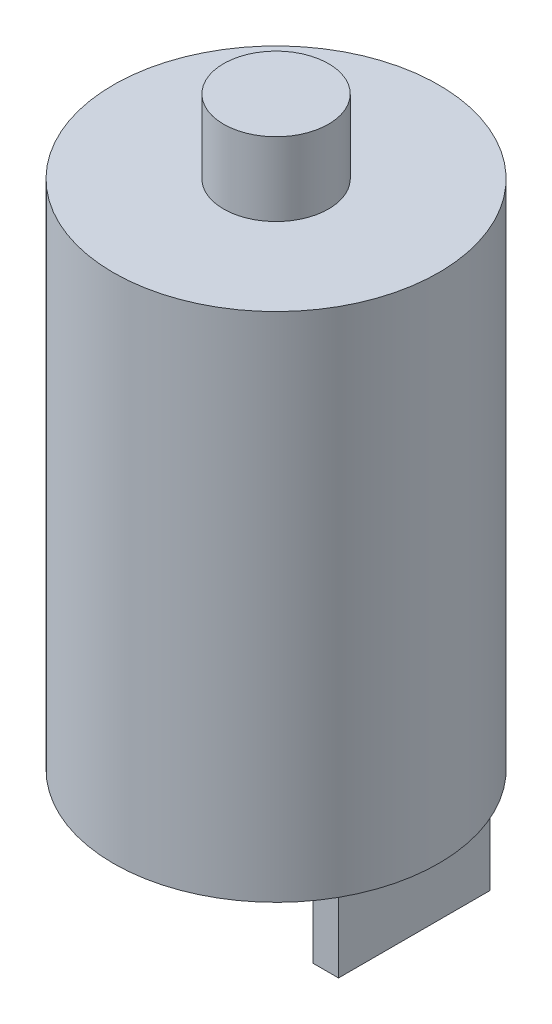
ISO-10303-21;
HEADER;
FILE_DESCRIPTION(('STEP AP214'),'2;1');
FILE_NAME('part.step','',(''),(''),'','','');
FILE_SCHEMA(('AUTOMOTIVE_DESIGN { 1 0 10303 214 1 1 1 1 }'));
ENDSEC;
DATA;
#1=APPLICATION_CONTEXT('core data for automotive mechanical design processes');
#2=APPLICATION_PROTOCOL_DEFINITION('international standard','automotive_design',2000,#1);
#3=PRODUCT_CONTEXT('',#1,'mechanical');
#4=PRODUCT('Part','Part','',(#3));
#5=PRODUCT_RELATED_PRODUCT_CATEGORY('part','',(#4));
#6=PRODUCT_DEFINITION_FORMATION('','',#4);
#7=PRODUCT_DEFINITION_CONTEXT('part definition',#1,'design');
#8=PRODUCT_DEFINITION('design','',#6,#7);
#9=PRODUCT_DEFINITION_SHAPE('','',#8);
#10=(LENGTH_UNIT() NAMED_UNIT(*) SI_UNIT(.MILLI.,.METRE.));
#11=(NAMED_UNIT(*) PLANE_ANGLE_UNIT() SI_UNIT($,.RADIAN.));
#12=(NAMED_UNIT(*) SI_UNIT($,.STERADIAN.) SOLID_ANGLE_UNIT());
#13=UNCERTAINTY_MEASURE_WITH_UNIT(LENGTH_MEASURE(1.E-05),#10,'distance_accuracy_value','');
#14=(GEOMETRIC_REPRESENTATION_CONTEXT(3) GLOBAL_UNCERTAINTY_ASSIGNED_CONTEXT((#13)) GLOBAL_UNIT_ASSIGNED_CONTEXT((#10,
#11,#12)) REPRESENTATION_CONTEXT('',''));
#15=CARTESIAN_POINT('',(0.,0.,0.));
#16=DIRECTION('',(0.,0.,1.));
#17=DIRECTION('',(1.,0.,0.));
#18=AXIS2_PLACEMENT_3D('',#15,#16,#17);
#19=CARTESIAN_POINT('',(0.,0.,0.));
#20=DIRECTION('',(0.,1.,0.));
#21=DIRECTION('',(0.,0.,1.));
#22=AXIS2_PLACEMENT_3D('',#19,#20,#21);
#23=PLANE('',#22);
#24=DIRECTION('',(0.,0.,-1.));
#25=VECTOR('',#24,1.);
#26=CARTESIAN_POINT('',(4.3072,0.,2.8899));
#27=LINE('',#26,#25);
#28=CARTESIAN_POINT('',(4.3072,0.,2.8899));
#29=VERTEX_POINT('',#28);
#30=CARTESIAN_POINT('',(4.3072,0.,-2.8899));
#31=VERTEX_POINT('',#30);
#32=EDGE_CURVE('E120',#29,#31,#27,.T.);
#33=ORIENTED_EDGE('',*,*,#32,.F.);
#34=DIRECTION('',(-1.,0.,0.));
#35=VECTOR('',#34,1.);
#36=CARTESIAN_POINT('',(4.3072,0.,2.8899));
#37=LINE('',#36,#35);
#38=CARTESIAN_POINT('',(5.2705,0.,2.8899));
#39=VERTEX_POINT('',#38);
#40=EDGE_CURVE('E133',#39,#29,#37,.T.);
#41=ORIENTED_EDGE('',*,*,#40,.F.);
#42=DIRECTION('',(0.,0.,1.));
#43=VECTOR('',#42,1.);
#44=CARTESIAN_POINT('',(5.2705,0.,2.8899));
#45=LINE('',#44,#43);
#46=CARTESIAN_POINT('',(5.2705,0.,-2.88990000000001));
#47=VERTEX_POINT('',#46);
#48=EDGE_CURVE('E142',#47,#39,#45,.T.);
#49=ORIENTED_EDGE('',*,*,#48,.F.);
#50=DIRECTION('',(1.,0.,0.));
#51=VECTOR('',#50,1.);
#52=CARTESIAN_POINT('',(4.3072,0.,-2.8899));
#53=LINE('',#52,#51);
#54=EDGE_CURVE('E123',#31,#47,#53,.T.);
#55=ORIENTED_EDGE('',*,*,#54,.F.);
#56=EDGE_LOOP('',(#33,#41,#49,#55));
#57=FACE_BOUND('',#56,.T.);
#58=CARTESIAN_POINT('',(0.,0.,0.));
#59=DIRECTION('',(0.,1.,0.));
#60=DIRECTION('',(0.,0.,1.));
#61=AXIS2_PLACEMENT_3D('',#58,#59,#60);
#62=CIRCLE('',#61,6.2);
#63=CARTESIAN_POINT('',(0.,0.,6.2));
#64=VERTEX_POINT('',#63);
#65=EDGE_CURVE('E36',#64,#64,#62,.T.);
#66=ORIENTED_EDGE('',*,*,#65,.F.);
#67=EDGE_LOOP('',(#66));
#68=FACE_BOUND('',#67,.T.);
#69=DIRECTION('',(0.,0.,1.));
#70=VECTOR('',#69,1.);
#71=CARTESIAN_POINT('',(-4.3072,0.,2.8899));
#72=LINE('',#71,#70);
#73=CARTESIAN_POINT('',(-4.3072,0.,-2.8899));
#74=VERTEX_POINT('',#73);
#75=CARTESIAN_POINT('',(-4.3072,0.,2.8899));
#76=VERTEX_POINT('',#75);
#77=EDGE_CURVE('E119',#74,#76,#72,.T.);
#78=ORIENTED_EDGE('',*,*,#77,.F.);
#79=DIRECTION('',(1.,0.,0.));
#80=VECTOR('',#79,1.);
#81=CARTESIAN_POINT('',(-4.3072,0.,-2.8899));
#82=LINE('',#81,#80);
#83=CARTESIAN_POINT('',(-5.2705,0.,-2.88990000000001));
#84=VERTEX_POINT('',#83);
#85=EDGE_CURVE('E116',#84,#74,#82,.T.);
#86=ORIENTED_EDGE('',*,*,#85,.F.);
#87=DIRECTION('',(0.,0.,-1.));
#88=VECTOR('',#87,1.);
#89=CARTESIAN_POINT('',(-5.2705,0.,2.8899));
#90=LINE('',#89,#88);
#91=CARTESIAN_POINT('',(-5.2705,0.,2.8899));
#92=VERTEX_POINT('',#91);
#93=EDGE_CURVE('E54',#92,#84,#90,.T.);
#94=ORIENTED_EDGE('',*,*,#93,.F.);
#95=DIRECTION('',(-1.,0.,0.));
#96=VECTOR('',#95,1.);
#97=CARTESIAN_POINT('',(-4.3072,0.,2.8899));
#98=LINE('',#97,#96);
#99=EDGE_CURVE('E49',#76,#92,#98,.T.);
#100=ORIENTED_EDGE('',*,*,#99,.F.);
#101=EDGE_LOOP('',(#78,#86,#94,#100));
#102=FACE_BOUND('',#101,.T.);
#103=ADVANCED_FACE('F32',(#57,#68,#102),#23,.F.);
#104=CARTESIAN_POINT('',(0.,19.5,0.));
#105=DIRECTION('',(0.,-1.,0.));
#106=DIRECTION('',(0.,0.,-1.));
#107=AXIS2_PLACEMENT_3D('',#104,#105,#106);
#108=CYLINDRICAL_SURFACE('',#107,6.2);
#109=CARTESIAN_POINT('',(0.,19.5,0.));
#110=DIRECTION('',(0.,1.,0.));
#111=DIRECTION('',(0.,0.,1.));
#112=AXIS2_PLACEMENT_3D('',#109,#110,#111);
#113=CIRCLE('',#112,6.2);
#114=CARTESIAN_POINT('',(0.,19.5,6.2));
#115=VERTEX_POINT('',#114);
#116=EDGE_CURVE('E41',#115,#115,#113,.T.);
#117=ORIENTED_EDGE('',*,*,#116,.F.);
#118=EDGE_LOOP('',(#117));
#119=FACE_BOUND('',#118,.T.);
#120=ORIENTED_EDGE('',*,*,#65,.T.);
#121=EDGE_LOOP('',(#120));
#122=FACE_BOUND('',#121,.T.);
#123=ADVANCED_FACE('F34',(#119,#122),#108,.T.);
#124=CARTESIAN_POINT('',(0.,19.5,0.));
#125=DIRECTION('',(0.,1.,0.));
#126=DIRECTION('',(0.,0.,1.));
#127=AXIS2_PLACEMENT_3D('',#124,#125,#126);
#128=PLANE('',#127);
#129=CARTESIAN_POINT('',(0.,19.5,0.));
#130=DIRECTION('',(0.,1.,0.));
#131=DIRECTION('',(0.,0.,1.));
#132=AXIS2_PLACEMENT_3D('',#129,#130,#131);
#133=CIRCLE('',#132,2.);
#134=CARTESIAN_POINT('',(0.,19.5,2.));
#135=VERTEX_POINT('',#134);
#136=EDGE_CURVE('E11',#135,#135,#133,.T.);
#137=ORIENTED_EDGE('',*,*,#136,.F.);
#138=EDGE_LOOP('',(#137));
#139=FACE_BOUND('',#138,.T.);
#140=ORIENTED_EDGE('',*,*,#116,.T.);
#141=EDGE_LOOP('',(#140));
#142=FACE_BOUND('',#141,.T.);
#143=ADVANCED_FACE('F223',(#139,#142),#128,.T.);
#144=CARTESIAN_POINT('',(0.,22.3,0.));
#145=DIRECTION('',(0.,-1.,0.));
#146=DIRECTION('',(0.,0.,-1.));
#147=AXIS2_PLACEMENT_3D('',#144,#145,#146);
#148=CYLINDRICAL_SURFACE('',#147,2.);
#149=CARTESIAN_POINT('',(0.,22.3,0.));
#150=DIRECTION('',(0.,1.,0.));
#151=DIRECTION('',(0.,0.,1.));
#152=AXIS2_PLACEMENT_3D('',#149,#150,#151);
#153=CIRCLE('',#152,2.);
#154=CARTESIAN_POINT('',(0.,22.3,2.));
#155=VERTEX_POINT('',#154);
#156=EDGE_CURVE('E158',#155,#155,#153,.T.);
#157=ORIENTED_EDGE('',*,*,#156,.F.);
#158=EDGE_LOOP('',(#157));
#159=FACE_BOUND('',#158,.T.);
#160=ORIENTED_EDGE('',*,*,#136,.T.);
#161=EDGE_LOOP('',(#160));
#162=FACE_BOUND('',#161,.T.);
#163=ADVANCED_FACE('F219',(#159,#162),#148,.T.);
#164=CARTESIAN_POINT('',(0.,22.3,0.));
#165=DIRECTION('',(0.,1.,0.));
#166=DIRECTION('',(0.,0.,1.));
#167=AXIS2_PLACEMENT_3D('',#164,#165,#166);
#168=PLANE('',#167);
#169=ORIENTED_EDGE('',*,*,#156,.T.);
#170=EDGE_LOOP('',(#169));
#171=FACE_BOUND('',#170,.T.);
#172=ADVANCED_FACE('F215',(#171),#168,.T.);
#173=CARTESIAN_POINT('',(4.3072,-2.8,2.8899));
#174=DIRECTION('',(1.,0.,0.));
#175=DIRECTION('',(0.,0.,-1.));
#176=AXIS2_PLACEMENT_3D('',#173,#174,#175);
#177=PLANE('',#176);
#178=ORIENTED_EDGE('',*,*,#32,.T.);
#179=DIRECTION('',(0.,1.,0.));
#180=VECTOR('',#179,1.);
#181=CARTESIAN_POINT('',(4.3072,-2.8,-2.8899));
#182=LINE('',#181,#180);
#183=CARTESIAN_POINT('',(4.3072,-2.8,-2.8899));
#184=VERTEX_POINT('',#183);
#185=EDGE_CURVE('E155',#184,#31,#182,.T.);
#186=ORIENTED_EDGE('',*,*,#185,.F.);
#187=DIRECTION('',(0.,0.,-1.));
#188=VECTOR('',#187,1.);
#189=CARTESIAN_POINT('',(4.3072,-2.8,2.8899));
#190=LINE('',#189,#188);
#191=CARTESIAN_POINT('',(4.3072,-2.8,2.8899));
#192=VERTEX_POINT('',#191);
#193=EDGE_CURVE('E129',#192,#184,#190,.T.);
#194=ORIENTED_EDGE('',*,*,#193,.F.);
#195=DIRECTION('',(0.,1.,0.));
#196=VECTOR('',#195,1.);
#197=CARTESIAN_POINT('',(4.3072,-2.8,2.8899));
#198=LINE('',#197,#196);
#199=EDGE_CURVE('E138',#192,#29,#198,.T.);
#200=ORIENTED_EDGE('',*,*,#199,.T.);
#201=EDGE_LOOP('',(#178,#186,#194,#200));
#202=FACE_BOUND('',#201,.T.);
#203=ADVANCED_FACE('F211',(#202),#177,.F.);
#204=CARTESIAN_POINT('',(4.3072,-2.8,-2.8899));
#205=DIRECTION('',(0.,0.,1.));
#206=DIRECTION('',(1.,0.,0.));
#207=AXIS2_PLACEMENT_3D('',#204,#205,#206);
#208=PLANE('',#207);
#209=ORIENTED_EDGE('',*,*,#54,.T.);
#210=DIRECTION('',(0.,1.,0.));
#211=VECTOR('',#210,1.);
#212=CARTESIAN_POINT('',(5.2705,-2.8,-2.88990000000001));
#213=LINE('',#212,#211);
#214=CARTESIAN_POINT('',(5.2705,-2.8,-2.88990000000001));
#215=VERTEX_POINT('',#214);
#216=EDGE_CURVE('E152',#215,#47,#213,.T.);
#217=ORIENTED_EDGE('',*,*,#216,.F.);
#218=DIRECTION('',(1.,0.,0.));
#219=VECTOR('',#218,1.);
#220=CARTESIAN_POINT('',(4.3072,-2.8,-2.8899));
#221=LINE('',#220,#219);
#222=EDGE_CURVE('E132',#184,#215,#221,.T.);
#223=ORIENTED_EDGE('',*,*,#222,.F.);
#224=ORIENTED_EDGE('',*,*,#185,.T.);
#225=EDGE_LOOP('',(#209,#217,#223,#224));
#226=FACE_BOUND('',#225,.T.);
#227=ADVANCED_FACE('F207',(#226),#208,.F.);
#228=CARTESIAN_POINT('',(5.2705,-2.8,2.8899));
#229=DIRECTION('',(-1.,0.,0.));
#230=DIRECTION('',(0.,0.,1.));
#231=AXIS2_PLACEMENT_3D('',#228,#229,#230);
#232=PLANE('',#231);
#233=ORIENTED_EDGE('',*,*,#48,.T.);
#234=DIRECTION('',(0.,1.,0.));
#235=VECTOR('',#234,1.);
#236=CARTESIAN_POINT('',(5.2705,-2.8,2.8899));
#237=LINE('',#236,#235);
#238=CARTESIAN_POINT('',(5.2705,-2.8,2.8899));
#239=VERTEX_POINT('',#238);
#240=EDGE_CURVE('E149',#239,#39,#237,.T.);
#241=ORIENTED_EDGE('',*,*,#240,.F.);
#242=DIRECTION('',(0.,0.,1.));
#243=VECTOR('',#242,1.);
#244=CARTESIAN_POINT('',(5.2705,-2.8,2.8899));
#245=LINE('',#244,#243);
#246=EDGE_CURVE('E135',#215,#239,#245,.T.);
#247=ORIENTED_EDGE('',*,*,#246,.F.);
#248=ORIENTED_EDGE('',*,*,#216,.T.);
#249=EDGE_LOOP('',(#233,#241,#247,#248));
#250=FACE_BOUND('',#249,.T.);
#251=ADVANCED_FACE('F203',(#250),#232,.F.);
#252=CARTESIAN_POINT('',(4.3072,-2.8,2.8899));
#253=DIRECTION('',(0.,0.,-1.));
#254=DIRECTION('',(-1.,0.,0.));
#255=AXIS2_PLACEMENT_3D('',#252,#253,#254);
#256=PLANE('',#255);
#257=ORIENTED_EDGE('',*,*,#40,.T.);
#258=ORIENTED_EDGE('',*,*,#199,.F.);
#259=DIRECTION('',(-1.,0.,0.));
#260=VECTOR('',#259,1.);
#261=CARTESIAN_POINT('',(4.3072,-2.8,2.8899));
#262=LINE('',#261,#260);
#263=EDGE_CURVE('E137',#239,#192,#262,.T.);
#264=ORIENTED_EDGE('',*,*,#263,.F.);
#265=ORIENTED_EDGE('',*,*,#240,.T.);
#266=EDGE_LOOP('',(#257,#258,#264,#265));
#267=FACE_BOUND('',#266,.T.);
#268=ADVANCED_FACE('F199',(#267),#256,.F.);
#269=CARTESIAN_POINT('',(0.,-2.8,0.));
#270=DIRECTION('',(0.,-1.,0.));
#271=DIRECTION('',(0.,0.,-1.));
#272=AXIS2_PLACEMENT_3D('',#269,#270,#271);
#273=PLANE('',#272);
#274=ORIENTED_EDGE('',*,*,#193,.T.);
#275=ORIENTED_EDGE('',*,*,#222,.T.);
#276=ORIENTED_EDGE('',*,*,#246,.T.);
#277=ORIENTED_EDGE('',*,*,#263,.T.);
#278=EDGE_LOOP('',(#274,#275,#276,#277));
#279=FACE_BOUND('',#278,.T.);
#280=ADVANCED_FACE('F196',(#279),#273,.T.);
#281=CARTESIAN_POINT('',(-4.3072,-2.8,2.8899));
#282=DIRECTION('',(-1.,0.,0.));
#283=DIRECTION('',(0.,0.,1.));
#284=AXIS2_PLACEMENT_3D('',#281,#282,#283);
#285=PLANE('',#284);
#286=ORIENTED_EDGE('',*,*,#77,.T.);
#287=DIRECTION('',(0.,1.,0.));
#288=VECTOR('',#287,1.);
#289=CARTESIAN_POINT('',(-4.3072,-2.8,2.8899));
#290=LINE('',#289,#288);
#291=CARTESIAN_POINT('',(-4.3072,-2.8,2.8899));
#292=VERTEX_POINT('',#291);
#293=EDGE_CURVE('E100',#292,#76,#290,.T.);
#294=ORIENTED_EDGE('',*,*,#293,.F.);
#295=DIRECTION('',(0.,0.,1.));
#296=VECTOR('',#295,1.);
#297=CARTESIAN_POINT('',(-4.3072,-2.8,2.8899));
#298=LINE('',#297,#296);
#299=CARTESIAN_POINT('',(-4.3072,-2.8,-2.8899));
#300=VERTEX_POINT('',#299);
#301=EDGE_CURVE('E107',#300,#292,#298,.T.);
#302=ORIENTED_EDGE('',*,*,#301,.F.);
#303=DIRECTION('',(0.,1.,0.));
#304=VECTOR('',#303,1.);
#305=CARTESIAN_POINT('',(-4.3072,-2.8,-2.8899));
#306=LINE('',#305,#304);
#307=EDGE_CURVE('E174',#300,#74,#306,.T.);
#308=ORIENTED_EDGE('',*,*,#307,.T.);
#309=EDGE_LOOP('',(#286,#294,#302,#308));
#310=FACE_BOUND('',#309,.T.);
#311=ADVANCED_FACE('F118',(#310),#285,.F.);
#312=CARTESIAN_POINT('',(-4.3072,-2.8,2.8899));
#313=DIRECTION('',(0.,0.,-1.));
#314=DIRECTION('',(-1.,0.,0.));
#315=AXIS2_PLACEMENT_3D('',#312,#313,#314);
#316=PLANE('',#315);
#317=ORIENTED_EDGE('',*,*,#99,.T.);
#318=DIRECTION('',(0.,1.,0.));
#319=VECTOR('',#318,1.);
#320=CARTESIAN_POINT('',(-5.2705,-2.8,2.8899));
#321=LINE('',#320,#319);
#322=CARTESIAN_POINT('',(-5.2705,-2.8,2.8899));
#323=VERTEX_POINT('',#322);
#324=EDGE_CURVE('E103',#323,#92,#321,.T.);
#325=ORIENTED_EDGE('',*,*,#324,.F.);
#326=DIRECTION('',(-1.,0.,0.));
#327=VECTOR('',#326,1.);
#328=CARTESIAN_POINT('',(-4.3072,-2.8,2.8899));
#329=LINE('',#328,#327);
#330=EDGE_CURVE('E96',#292,#323,#329,.T.);
#331=ORIENTED_EDGE('',*,*,#330,.F.);
#332=ORIENTED_EDGE('',*,*,#293,.T.);
#333=EDGE_LOOP('',(#317,#325,#331,#332));
#334=FACE_BOUND('',#333,.T.);
#335=ADVANCED_FACE('F98',(#334),#316,.F.);
#336=CARTESIAN_POINT('',(-5.2705,-2.8,2.8899));
#337=DIRECTION('',(1.,0.,0.));
#338=DIRECTION('',(0.,0.,-1.));
#339=AXIS2_PLACEMENT_3D('',#336,#337,#338);
#340=PLANE('',#339);
#341=ORIENTED_EDGE('',*,*,#93,.T.);
#342=DIRECTION('',(0.,1.,0.));
#343=VECTOR('',#342,1.);
#344=CARTESIAN_POINT('',(-5.2705,-2.8,-2.88990000000001));
#345=LINE('',#344,#343);
#346=CARTESIAN_POINT('',(-5.2705,-2.8,-2.88990000000001));
#347=VERTEX_POINT('',#346);
#348=EDGE_CURVE('E125',#347,#84,#345,.T.);
#349=ORIENTED_EDGE('',*,*,#348,.F.);
#350=DIRECTION('',(0.,0.,-1.));
#351=VECTOR('',#350,1.);
#352=CARTESIAN_POINT('',(-5.2705,-2.8,2.8899));
#353=LINE('',#352,#351);
#354=EDGE_CURVE('E106',#323,#347,#353,.T.);
#355=ORIENTED_EDGE('',*,*,#354,.F.);
#356=ORIENTED_EDGE('',*,*,#324,.T.);
#357=EDGE_LOOP('',(#341,#349,#355,#356));
#358=FACE_BOUND('',#357,.T.);
#359=ADVANCED_FACE('F183',(#358),#340,.F.);
#360=CARTESIAN_POINT('',(-4.3072,-2.8,-2.8899));
#361=DIRECTION('',(0.,0.,1.));
#362=DIRECTION('',(1.,0.,0.));
#363=AXIS2_PLACEMENT_3D('',#360,#361,#362);
#364=PLANE('',#363);
#365=ORIENTED_EDGE('',*,*,#85,.T.);
#366=ORIENTED_EDGE('',*,*,#307,.F.);
#367=DIRECTION('',(1.,0.,0.));
#368=VECTOR('',#367,1.);
#369=CARTESIAN_POINT('',(-4.3072,-2.8,-2.8899));
#370=LINE('',#369,#368);
#371=EDGE_CURVE('E112',#347,#300,#370,.T.);
#372=ORIENTED_EDGE('',*,*,#371,.F.);
#373=ORIENTED_EDGE('',*,*,#348,.T.);
#374=EDGE_LOOP('',(#365,#366,#372,#373));
#375=FACE_BOUND('',#374,.T.);
#376=ADVANCED_FACE('F173',(#375),#364,.F.);
#377=CARTESIAN_POINT('',(0.,-2.8,0.));
#378=DIRECTION('',(0.,1.,0.));
#379=DIRECTION('',(0.,0.,1.));
#380=AXIS2_PLACEMENT_3D('',#377,#378,#379);
#381=PLANE('',#380);
#382=ORIENTED_EDGE('',*,*,#301,.T.);
#383=ORIENTED_EDGE('',*,*,#330,.T.);
#384=ORIENTED_EDGE('',*,*,#354,.T.);
#385=ORIENTED_EDGE('',*,*,#371,.T.);
#386=EDGE_LOOP('',(#382,#383,#384,#385));
#387=FACE_BOUND('',#386,.T.);
#388=ADVANCED_FACE('F110',(#387),#381,.F.);
#389=CLOSED_SHELL('',(#103,#123,#143,#163,#172,#203,#227,#251,#268,#280,#311,#335,#359,#376,#388));
#390=MANIFOLD_SOLID_BREP('B2',#389);
#391=ADVANCED_BREP_SHAPE_REPRESENTATION('',(#18,#390),#14);
#392=SHAPE_DEFINITION_REPRESENTATION(#9,#391);
ENDSEC;
END-ISO-10303-21;
